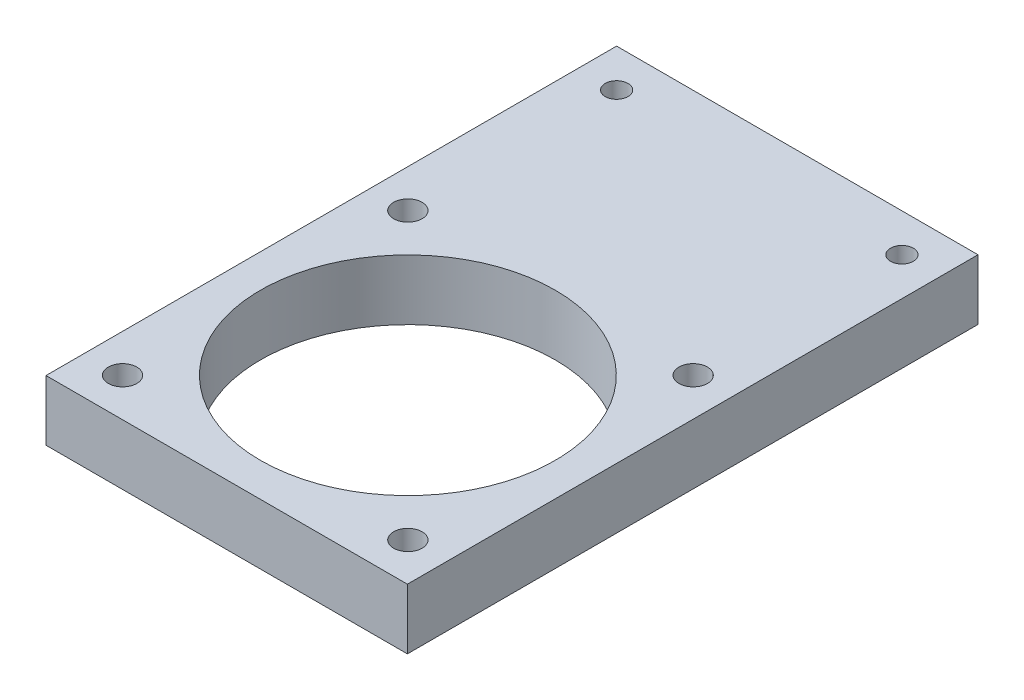
ISO-10303-21;
HEADER;
FILE_DESCRIPTION(('STEP AP214'),'2;1');
FILE_NAME('part.step','',(''),(''),'','','');
FILE_SCHEMA(('AUTOMOTIVE_DESIGN { 1 0 10303 214 1 1 1 1 }'));
ENDSEC;
DATA;
#1=APPLICATION_CONTEXT('core data for automotive mechanical design processes');
#2=APPLICATION_PROTOCOL_DEFINITION('international standard','automotive_design',2000,#1);
#3=PRODUCT_CONTEXT('',#1,'mechanical');
#4=PRODUCT('Part','Part','',(#3));
#5=PRODUCT_RELATED_PRODUCT_CATEGORY('part','',(#4));
#6=PRODUCT_DEFINITION_FORMATION('','',#4);
#7=PRODUCT_DEFINITION_CONTEXT('part definition',#1,'design');
#8=PRODUCT_DEFINITION('design','',#6,#7);
#9=PRODUCT_DEFINITION_SHAPE('','',#8);
#10=(LENGTH_UNIT() NAMED_UNIT(*) SI_UNIT(.MILLI.,.METRE.));
#11=(NAMED_UNIT(*) PLANE_ANGLE_UNIT() SI_UNIT($,.RADIAN.));
#12=(NAMED_UNIT(*) SI_UNIT($,.STERADIAN.) SOLID_ANGLE_UNIT());
#13=UNCERTAINTY_MEASURE_WITH_UNIT(LENGTH_MEASURE(1.E-05),#10,'distance_accuracy_value','');
#14=(GEOMETRIC_REPRESENTATION_CONTEXT(3) GLOBAL_UNCERTAINTY_ASSIGNED_CONTEXT((#13)) GLOBAL_UNIT_ASSIGNED_CONTEXT((#10,
#11,#12)) REPRESENTATION_CONTEXT('',''));
#15=CARTESIAN_POINT('',(0.,0.,0.));
#16=DIRECTION('',(0.,0.,1.));
#17=DIRECTION('',(1.,0.,0.));
#18=AXIS2_PLACEMENT_3D('',#15,#16,#17);
#19=CARTESIAN_POINT('',(0.,6.35,0.));
#20=DIRECTION('',(0.,-1.,0.));
#21=DIRECTION('',(0.,0.,-1.));
#22=AXIS2_PLACEMENT_3D('',#19,#20,#21);
#23=PLANE('',#22);
#24=DIRECTION('',(0.,0.,1.));
#25=VECTOR('',#24,1.);
#26=CARTESIAN_POINT('',(0.,6.35,0.));
#27=LINE('',#26,#25);
#28=CARTESIAN_POINT('',(0.,6.35,-60.));
#29=VERTEX_POINT('',#28);
#30=CARTESIAN_POINT('',(0.,6.35,0.));
#31=VERTEX_POINT('',#30);
#32=EDGE_CURVE('E92',#29,#31,#27,.T.);
#33=ORIENTED_EDGE('',*,*,#32,.T.);
#34=DIRECTION('',(1.,0.,0.));
#35=VECTOR('',#34,1.);
#36=CARTESIAN_POINT('',(0.,6.35,0.));
#37=LINE('',#36,#35);
#38=CARTESIAN_POINT('',(38.,6.35,0.));
#39=VERTEX_POINT('',#38);
#40=EDGE_CURVE('E87',#31,#39,#37,.T.);
#41=ORIENTED_EDGE('',*,*,#40,.T.);
#42=DIRECTION('',(0.,0.,-1.));
#43=VECTOR('',#42,1.);
#44=CARTESIAN_POINT('',(38.,6.35,0.));
#45=LINE('',#44,#43);
#46=CARTESIAN_POINT('',(38.,6.35,-60.));
#47=VERTEX_POINT('',#46);
#48=EDGE_CURVE('E90',#39,#47,#45,.T.);
#49=ORIENTED_EDGE('',*,*,#48,.T.);
#50=DIRECTION('',(-1.,0.,0.));
#51=VECTOR('',#50,1.);
#52=CARTESIAN_POINT('',(0.,6.35,-60.));
#53=LINE('',#52,#51);
#54=EDGE_CURVE('E57',#47,#29,#53,.T.);
#55=ORIENTED_EDGE('',*,*,#54,.T.);
#56=EDGE_LOOP('',(#33,#41,#49,#55));
#57=FACE_BOUND('',#56,.T.);
#58=CARTESIAN_POINT('',(4.,6.35,-4.04999999999999));
#59=DIRECTION('',(0.,1.,0.));
#60=DIRECTION('',(0.,0.,1.));
#61=AXIS2_PLACEMENT_3D('',#58,#59,#60);
#62=CIRCLE('',#61,1.5);
#63=CARTESIAN_POINT('',(4.,6.35,-2.54999999999999));
#64=VERTEX_POINT('',#63);
#65=EDGE_CURVE('E112',#64,#64,#62,.T.);
#66=ORIENTED_EDGE('',*,*,#65,.F.);
#67=EDGE_LOOP('',(#66));
#68=FACE_BOUND('',#67,.T.);
#69=CARTESIAN_POINT('',(34.,6.35,-4.04999999999999));
#70=DIRECTION('',(0.,1.,0.));
#71=DIRECTION('',(0.,0.,1.));
#72=AXIS2_PLACEMENT_3D('',#69,#70,#71);
#73=CIRCLE('',#72,1.5);
#74=CARTESIAN_POINT('',(34.,6.35,-2.54999999999999));
#75=VERTEX_POINT('',#74);
#76=EDGE_CURVE('E134',#75,#75,#73,.T.);
#77=ORIENTED_EDGE('',*,*,#76,.F.);
#78=EDGE_LOOP('',(#77));
#79=FACE_BOUND('',#78,.T.);
#80=CARTESIAN_POINT('',(34.,6.35,-34.05));
#81=DIRECTION('',(0.,1.,0.));
#82=DIRECTION('',(0.,0.,1.));
#83=AXIS2_PLACEMENT_3D('',#80,#81,#82);
#84=CIRCLE('',#83,1.5);
#85=CARTESIAN_POINT('',(34.,6.35,-32.55));
#86=VERTEX_POINT('',#85);
#87=EDGE_CURVE('E142',#86,#86,#84,.T.);
#88=ORIENTED_EDGE('',*,*,#87,.F.);
#89=EDGE_LOOP('',(#88));
#90=FACE_BOUND('',#89,.T.);
#91=CARTESIAN_POINT('',(3.99999999999999,6.35,-34.05));
#92=DIRECTION('',(0.,1.,0.));
#93=DIRECTION('',(0.,0.,1.));
#94=AXIS2_PLACEMENT_3D('',#91,#92,#93);
#95=CIRCLE('',#94,1.5);
#96=CARTESIAN_POINT('',(3.99999999999999,6.35,-32.55));
#97=VERTEX_POINT('',#96);
#98=EDGE_CURVE('E150',#97,#97,#95,.T.);
#99=ORIENTED_EDGE('',*,*,#98,.F.);
#100=EDGE_LOOP('',(#99));
#101=FACE_BOUND('',#100,.T.);
#102=CARTESIAN_POINT('',(19.,6.35,-19.05));
#103=DIRECTION('',(0.,1.,0.));
#104=DIRECTION('',(0.,0.,1.));
#105=AXIS2_PLACEMENT_3D('',#102,#103,#104);
#106=CIRCLE('',#105,15.5);
#107=CARTESIAN_POINT('',(19.,6.35,-3.54999999999999));
#108=VERTEX_POINT('',#107);
#109=EDGE_CURVE('E158',#108,#108,#106,.T.);
#110=ORIENTED_EDGE('',*,*,#109,.F.);
#111=EDGE_LOOP('',(#110));
#112=FACE_BOUND('',#111,.T.);
#113=CARTESIAN_POINT('',(34.,6.35,-56.));
#114=DIRECTION('',(0.,1.,0.));
#115=DIRECTION('',(0.,0.,1.));
#116=AXIS2_PLACEMENT_3D('',#113,#114,#115);
#117=CIRCLE('',#116,1.2);
#118=CARTESIAN_POINT('',(34.,6.35,-54.8));
#119=VERTEX_POINT('',#118);
#120=EDGE_CURVE('E166',#119,#119,#117,.T.);
#121=ORIENTED_EDGE('',*,*,#120,.F.);
#122=EDGE_LOOP('',(#121));
#123=FACE_BOUND('',#122,.T.);
#124=CARTESIAN_POINT('',(4.,6.35,-56.));
#125=DIRECTION('',(0.,1.,0.));
#126=DIRECTION('',(0.,0.,1.));
#127=AXIS2_PLACEMENT_3D('',#124,#125,#126);
#128=CIRCLE('',#127,1.2);
#129=CARTESIAN_POINT('',(4.,6.35,-54.8));
#130=VERTEX_POINT('',#129);
#131=EDGE_CURVE('E174',#130,#130,#128,.T.);
#132=ORIENTED_EDGE('',*,*,#131,.F.);
#133=EDGE_LOOP('',(#132));
#134=FACE_BOUND('',#133,.T.);
#135=ADVANCED_FACE('F39',(#57,#68,#79,#90,#101,#112,#123,#134),#23,.F.);
#136=CARTESIAN_POINT('',(0.,0.,0.));
#137=DIRECTION('',(0.,-1.,0.));
#138=DIRECTION('',(0.,0.,-1.));
#139=AXIS2_PLACEMENT_3D('',#136,#137,#138);
#140=PLANE('',#139);
#141=CARTESIAN_POINT('',(34.,0.,-56.));
#142=DIRECTION('',(0.,1.,0.));
#143=DIRECTION('',(0.,0.,1.));
#144=AXIS2_PLACEMENT_3D('',#141,#142,#143);
#145=CIRCLE('',#144,1.2);
#146=CARTESIAN_POINT('',(34.,0.,-54.8));
#147=VERTEX_POINT('',#146);
#148=EDGE_CURVE('E170',#147,#147,#145,.T.);
#149=ORIENTED_EDGE('',*,*,#148,.T.);
#150=EDGE_LOOP('',(#149));
#151=FACE_BOUND('',#150,.T.);
#152=CARTESIAN_POINT('',(3.99999999999999,0.,-34.05));
#153=DIRECTION('',(0.,1.,0.));
#154=DIRECTION('',(0.,0.,1.));
#155=AXIS2_PLACEMENT_3D('',#152,#153,#154);
#156=CIRCLE('',#155,1.5);
#157=CARTESIAN_POINT('',(3.99999999999999,0.,-32.55));
#158=VERTEX_POINT('',#157);
#159=EDGE_CURVE('E154',#158,#158,#156,.T.);
#160=ORIENTED_EDGE('',*,*,#159,.T.);
#161=EDGE_LOOP('',(#160));
#162=FACE_BOUND('',#161,.T.);
#163=CARTESIAN_POINT('',(34.,0.,-4.04999999999999));
#164=DIRECTION('',(0.,1.,0.));
#165=DIRECTION('',(0.,0.,1.));
#166=AXIS2_PLACEMENT_3D('',#163,#164,#165);
#167=CIRCLE('',#166,1.5);
#168=CARTESIAN_POINT('',(34.,0.,-2.54999999999999));
#169=VERTEX_POINT('',#168);
#170=EDGE_CURVE('E138',#169,#169,#167,.T.);
#171=ORIENTED_EDGE('',*,*,#170,.T.);
#172=EDGE_LOOP('',(#171));
#173=FACE_BOUND('',#172,.T.);
#174=DIRECTION('',(0.,0.,1.));
#175=VECTOR('',#174,1.);
#176=CARTESIAN_POINT('',(0.,0.,0.));
#177=LINE('',#176,#175);
#178=CARTESIAN_POINT('',(0.,0.,-60.));
#179=VERTEX_POINT('',#178);
#180=CARTESIAN_POINT('',(0.,0.,0.));
#181=VERTEX_POINT('',#180);
#182=EDGE_CURVE('E108',#179,#181,#177,.T.);
#183=ORIENTED_EDGE('',*,*,#182,.F.);
#184=DIRECTION('',(-1.,0.,0.));
#185=VECTOR('',#184,1.);
#186=CARTESIAN_POINT('',(0.,0.,-60.));
#187=LINE('',#186,#185);
#188=CARTESIAN_POINT('',(38.,0.,-60.));
#189=VERTEX_POINT('',#188);
#190=EDGE_CURVE('E80',#189,#179,#187,.T.);
#191=ORIENTED_EDGE('',*,*,#190,.F.);
#192=DIRECTION('',(0.,0.,-1.));
#193=VECTOR('',#192,1.);
#194=CARTESIAN_POINT('',(38.,0.,0.));
#195=LINE('',#194,#193);
#196=CARTESIAN_POINT('',(38.,0.,0.));
#197=VERTEX_POINT('',#196);
#198=EDGE_CURVE('E74',#197,#189,#195,.T.);
#199=ORIENTED_EDGE('',*,*,#198,.F.);
#200=DIRECTION('',(1.,0.,0.));
#201=VECTOR('',#200,1.);
#202=CARTESIAN_POINT('',(0.,0.,0.));
#203=LINE('',#202,#201);
#204=EDGE_CURVE('E97',#181,#197,#203,.T.);
#205=ORIENTED_EDGE('',*,*,#204,.F.);
#206=EDGE_LOOP('',(#183,#191,#199,#205));
#207=FACE_BOUND('',#206,.T.);
#208=CARTESIAN_POINT('',(4.,0.,-4.04999999999999));
#209=DIRECTION('',(0.,1.,0.));
#210=DIRECTION('',(0.,0.,1.));
#211=AXIS2_PLACEMENT_3D('',#208,#209,#210);
#212=CIRCLE('',#211,1.5);
#213=CARTESIAN_POINT('',(4.,0.,-2.54999999999999));
#214=VERTEX_POINT('',#213);
#215=EDGE_CURVE('E130',#214,#214,#212,.T.);
#216=ORIENTED_EDGE('',*,*,#215,.T.);
#217=EDGE_LOOP('',(#216));
#218=FACE_BOUND('',#217,.T.);
#219=CARTESIAN_POINT('',(34.,0.,-34.05));
#220=DIRECTION('',(0.,1.,0.));
#221=DIRECTION('',(0.,0.,1.));
#222=AXIS2_PLACEMENT_3D('',#219,#220,#221);
#223=CIRCLE('',#222,1.5);
#224=CARTESIAN_POINT('',(34.,0.,-32.55));
#225=VERTEX_POINT('',#224);
#226=EDGE_CURVE('E146',#225,#225,#223,.T.);
#227=ORIENTED_EDGE('',*,*,#226,.T.);
#228=EDGE_LOOP('',(#227));
#229=FACE_BOUND('',#228,.T.);
#230=CARTESIAN_POINT('',(19.,0.,-19.05));
#231=DIRECTION('',(0.,1.,0.));
#232=DIRECTION('',(0.,0.,1.));
#233=AXIS2_PLACEMENT_3D('',#230,#231,#232);
#234=CIRCLE('',#233,15.5);
#235=CARTESIAN_POINT('',(19.,0.,-3.54999999999999));
#236=VERTEX_POINT('',#235);
#237=EDGE_CURVE('E162',#236,#236,#234,.T.);
#238=ORIENTED_EDGE('',*,*,#237,.T.);
#239=EDGE_LOOP('',(#238));
#240=FACE_BOUND('',#239,.T.);
#241=CARTESIAN_POINT('',(4.,0.,-56.));
#242=DIRECTION('',(0.,1.,0.));
#243=DIRECTION('',(0.,0.,1.));
#244=AXIS2_PLACEMENT_3D('',#241,#242,#243);
#245=CIRCLE('',#244,1.2);
#246=CARTESIAN_POINT('',(4.,0.,-54.8));
#247=VERTEX_POINT('',#246);
#248=EDGE_CURVE('E178',#247,#247,#245,.T.);
#249=ORIENTED_EDGE('',*,*,#248,.T.);
#250=EDGE_LOOP('',(#249));
#251=FACE_BOUND('',#250,.T.);
#252=ADVANCED_FACE('F125',(#151,#162,#173,#207,#218,#229,#240,#251),#140,.T.);
#253=CARTESIAN_POINT('',(0.,6.35,0.));
#254=DIRECTION('',(1.,0.,0.));
#255=DIRECTION('',(0.,0.,-1.));
#256=AXIS2_PLACEMENT_3D('',#253,#254,#255);
#257=PLANE('',#256);
#258=ORIENTED_EDGE('',*,*,#182,.T.);
#259=DIRECTION('',(0.,-1.,0.));
#260=VECTOR('',#259,1.);
#261=CARTESIAN_POINT('',(0.,6.35,0.));
#262=LINE('',#261,#260);
#263=EDGE_CURVE('E11',#31,#181,#262,.T.);
#264=ORIENTED_EDGE('',*,*,#263,.F.);
#265=ORIENTED_EDGE('',*,*,#32,.F.);
#266=DIRECTION('',(0.,-1.,0.));
#267=VECTOR('',#266,1.);
#268=CARTESIAN_POINT('',(0.,6.35,-60.));
#269=LINE('',#268,#267);
#270=EDGE_CURVE('E104',#29,#179,#269,.T.);
#271=ORIENTED_EDGE('',*,*,#270,.T.);
#272=EDGE_LOOP('',(#258,#264,#265,#271));
#273=FACE_BOUND('',#272,.T.);
#274=ADVANCED_FACE('F41',(#273),#257,.F.);
#275=CARTESIAN_POINT('',(0.,6.35,0.));
#276=DIRECTION('',(0.,0.,-1.));
#277=DIRECTION('',(-1.,0.,0.));
#278=AXIS2_PLACEMENT_3D('',#275,#276,#277);
#279=PLANE('',#278);
#280=ORIENTED_EDGE('',*,*,#204,.T.);
#281=DIRECTION('',(0.,-1.,0.));
#282=VECTOR('',#281,1.);
#283=CARTESIAN_POINT('',(38.,6.35,0.));
#284=LINE('',#283,#282);
#285=EDGE_CURVE('E49',#39,#197,#284,.T.);
#286=ORIENTED_EDGE('',*,*,#285,.F.);
#287=ORIENTED_EDGE('',*,*,#40,.F.);
#288=ORIENTED_EDGE('',*,*,#263,.T.);
#289=EDGE_LOOP('',(#280,#286,#287,#288));
#290=FACE_BOUND('',#289,.T.);
#291=ADVANCED_FACE('F96',(#290),#279,.F.);
#292=CARTESIAN_POINT('',(38.,6.35,0.));
#293=DIRECTION('',(-1.,0.,0.));
#294=DIRECTION('',(0.,0.,1.));
#295=AXIS2_PLACEMENT_3D('',#292,#293,#294);
#296=PLANE('',#295);
#297=ORIENTED_EDGE('',*,*,#198,.T.);
#298=DIRECTION('',(0.,-1.,0.));
#299=VECTOR('',#298,1.);
#300=CARTESIAN_POINT('',(38.,6.35,-60.));
#301=LINE('',#300,#299);
#302=EDGE_CURVE('E99',#47,#189,#301,.T.);
#303=ORIENTED_EDGE('',*,*,#302,.F.);
#304=ORIENTED_EDGE('',*,*,#48,.F.);
#305=ORIENTED_EDGE('',*,*,#285,.T.);
#306=EDGE_LOOP('',(#297,#303,#304,#305));
#307=FACE_BOUND('',#306,.T.);
#308=ADVANCED_FACE('F100',(#307),#296,.F.);
#309=CARTESIAN_POINT('',(0.,6.35,-60.));
#310=DIRECTION('',(0.,0.,1.));
#311=DIRECTION('',(1.,0.,0.));
#312=AXIS2_PLACEMENT_3D('',#309,#310,#311);
#313=PLANE('',#312);
#314=ORIENTED_EDGE('',*,*,#190,.T.);
#315=ORIENTED_EDGE('',*,*,#270,.F.);
#316=ORIENTED_EDGE('',*,*,#54,.F.);
#317=ORIENTED_EDGE('',*,*,#302,.T.);
#318=EDGE_LOOP('',(#314,#315,#316,#317));
#319=FACE_BOUND('',#318,.T.);
#320=ADVANCED_FACE('F122',(#319),#313,.F.);
#321=CARTESIAN_POINT('',(4.,6.35,-4.04999999999999));
#322=DIRECTION('',(0.,-1.,0.));
#323=DIRECTION('',(0.,0.,-1.));
#324=AXIS2_PLACEMENT_3D('',#321,#322,#323);
#325=CYLINDRICAL_SURFACE('',#324,1.5);
#326=ORIENTED_EDGE('',*,*,#65,.T.);
#327=EDGE_LOOP('',(#326));
#328=FACE_BOUND('',#327,.T.);
#329=ORIENTED_EDGE('',*,*,#215,.F.);
#330=EDGE_LOOP('',(#329));
#331=FACE_BOUND('',#330,.T.);
#332=ADVANCED_FACE('F197',(#328,#331),#325,.F.);
#333=CARTESIAN_POINT('',(34.,6.35,-4.04999999999999));
#334=DIRECTION('',(0.,-1.,0.));
#335=DIRECTION('',(0.,0.,-1.));
#336=AXIS2_PLACEMENT_3D('',#333,#334,#335);
#337=CYLINDRICAL_SURFACE('',#336,1.5);
#338=ORIENTED_EDGE('',*,*,#76,.T.);
#339=EDGE_LOOP('',(#338));
#340=FACE_BOUND('',#339,.T.);
#341=ORIENTED_EDGE('',*,*,#170,.F.);
#342=EDGE_LOOP('',(#341));
#343=FACE_BOUND('',#342,.T.);
#344=ADVANCED_FACE('F243',(#340,#343),#337,.F.);
#345=CARTESIAN_POINT('',(34.,6.35,-34.05));
#346=DIRECTION('',(0.,-1.,0.));
#347=DIRECTION('',(0.,0.,-1.));
#348=AXIS2_PLACEMENT_3D('',#345,#346,#347);
#349=CYLINDRICAL_SURFACE('',#348,1.5);
#350=ORIENTED_EDGE('',*,*,#87,.T.);
#351=EDGE_LOOP('',(#350));
#352=FACE_BOUND('',#351,.T.);
#353=ORIENTED_EDGE('',*,*,#226,.F.);
#354=EDGE_LOOP('',(#353));
#355=FACE_BOUND('',#354,.T.);
#356=ADVANCED_FACE('F251',(#352,#355),#349,.F.);
#357=CARTESIAN_POINT('',(3.99999999999999,6.35,-34.05));
#358=DIRECTION('',(0.,-1.,0.));
#359=DIRECTION('',(0.,0.,-1.));
#360=AXIS2_PLACEMENT_3D('',#357,#358,#359);
#361=CYLINDRICAL_SURFACE('',#360,1.5);
#362=ORIENTED_EDGE('',*,*,#98,.T.);
#363=EDGE_LOOP('',(#362));
#364=FACE_BOUND('',#363,.T.);
#365=ORIENTED_EDGE('',*,*,#159,.F.);
#366=EDGE_LOOP('',(#365));
#367=FACE_BOUND('',#366,.T.);
#368=ADVANCED_FACE('F259',(#364,#367),#361,.F.);
#369=CARTESIAN_POINT('',(19.,6.35,-19.05));
#370=DIRECTION('',(0.,-1.,0.));
#371=DIRECTION('',(0.,0.,-1.));
#372=AXIS2_PLACEMENT_3D('',#369,#370,#371);
#373=CYLINDRICAL_SURFACE('',#372,15.5);
#374=ORIENTED_EDGE('',*,*,#109,.T.);
#375=EDGE_LOOP('',(#374));
#376=FACE_BOUND('',#375,.T.);
#377=ORIENTED_EDGE('',*,*,#237,.F.);
#378=EDGE_LOOP('',(#377));
#379=FACE_BOUND('',#378,.T.);
#380=ADVANCED_FACE('F268',(#376,#379),#373,.F.);
#381=CARTESIAN_POINT('',(34.,6.35,-56.));
#382=DIRECTION('',(0.,-1.,0.));
#383=DIRECTION('',(0.,0.,-1.));
#384=AXIS2_PLACEMENT_3D('',#381,#382,#383);
#385=CYLINDRICAL_SURFACE('',#384,1.2);
#386=ORIENTED_EDGE('',*,*,#120,.T.);
#387=EDGE_LOOP('',(#386));
#388=FACE_BOUND('',#387,.T.);
#389=ORIENTED_EDGE('',*,*,#148,.F.);
#390=EDGE_LOOP('',(#389));
#391=FACE_BOUND('',#390,.T.);
#392=ADVANCED_FACE('F277',(#388,#391),#385,.F.);
#393=CARTESIAN_POINT('',(4.,6.35,-56.));
#394=DIRECTION('',(0.,-1.,0.));
#395=DIRECTION('',(0.,0.,-1.));
#396=AXIS2_PLACEMENT_3D('',#393,#394,#395);
#397=CYLINDRICAL_SURFACE('',#396,1.2);
#398=ORIENTED_EDGE('',*,*,#131,.T.);
#399=EDGE_LOOP('',(#398));
#400=FACE_BOUND('',#399,.T.);
#401=ORIENTED_EDGE('',*,*,#248,.F.);
#402=EDGE_LOOP('',(#401));
#403=FACE_BOUND('',#402,.T.);
#404=ADVANCED_FACE('F186',(#400,#403),#397,.F.);
#405=CLOSED_SHELL('',(#135,#252,#274,#291,#308,#320,#332,#344,#356,#368,#380,#392,#404));
#406=MANIFOLD_SOLID_BREP('B2',#405);
#407=ADVANCED_BREP_SHAPE_REPRESENTATION('',(#18,#406),#14);
#408=SHAPE_DEFINITION_REPRESENTATION(#9,#407);
ENDSEC;
END-ISO-10303-21;
